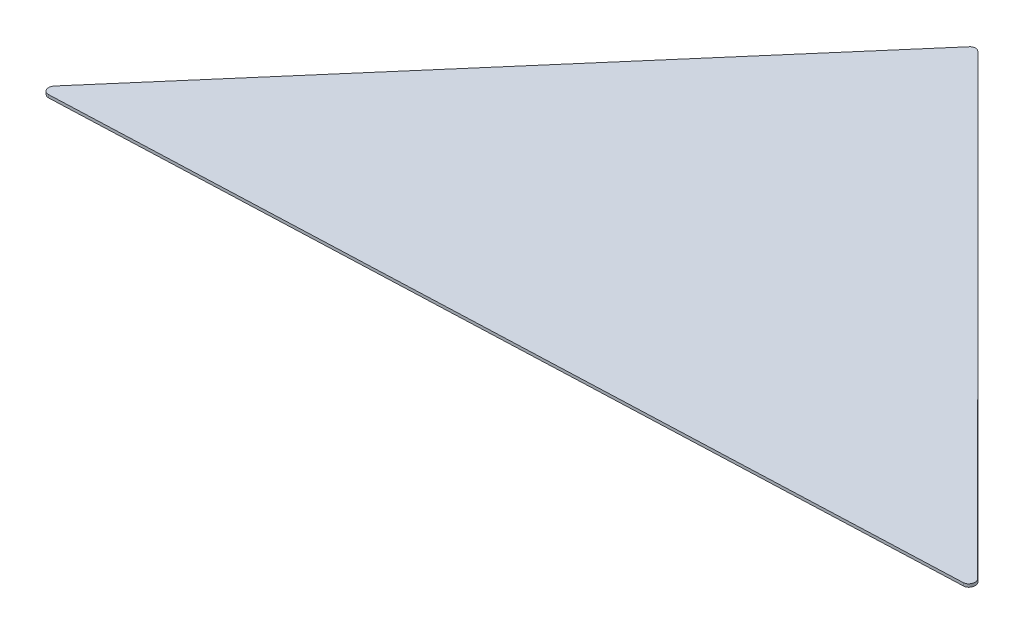
ISO-10303-21;
HEADER;
FILE_DESCRIPTION(('STEP AP214'),'2;1');
FILE_NAME('part.step','',(''),(''),'','','');
FILE_SCHEMA(('AUTOMOTIVE_DESIGN { 1 0 10303 214 1 1 1 1 }'));
ENDSEC;
DATA;
#1=APPLICATION_CONTEXT('core data for automotive mechanical design processes');
#2=APPLICATION_PROTOCOL_DEFINITION('international standard','automotive_design',2000,#1);
#3=PRODUCT_CONTEXT('',#1,'mechanical');
#4=PRODUCT('Part','Part','',(#3));
#5=PRODUCT_RELATED_PRODUCT_CATEGORY('part','',(#4));
#6=PRODUCT_DEFINITION_FORMATION('','',#4);
#7=PRODUCT_DEFINITION_CONTEXT('part definition',#1,'design');
#8=PRODUCT_DEFINITION('design','',#6,#7);
#9=PRODUCT_DEFINITION_SHAPE('','',#8);
#10=(LENGTH_UNIT() NAMED_UNIT(*) SI_UNIT(.MILLI.,.METRE.));
#11=(NAMED_UNIT(*) PLANE_ANGLE_UNIT() SI_UNIT($,.RADIAN.));
#12=(NAMED_UNIT(*) SI_UNIT($,.STERADIAN.) SOLID_ANGLE_UNIT());
#13=UNCERTAINTY_MEASURE_WITH_UNIT(LENGTH_MEASURE(1.E-05),#10,'distance_accuracy_value','');
#14=(GEOMETRIC_REPRESENTATION_CONTEXT(3) GLOBAL_UNCERTAINTY_ASSIGNED_CONTEXT((#13)) GLOBAL_UNIT_ASSIGNED_CONTEXT((#10,
#11,#12)) REPRESENTATION_CONTEXT('',''));
#15=CARTESIAN_POINT('',(0.,0.,0.));
#16=DIRECTION('',(0.,0.,1.));
#17=DIRECTION('',(1.,0.,0.));
#18=AXIS2_PLACEMENT_3D('',#15,#16,#17);
#19=CARTESIAN_POINT('',(198.888232937811,-1905.59670843705,-983.717640647093));
#20=DIRECTION('',(0.0386038565877099,-0.998597990155389,-0.0362187287763312));
#21=DIRECTION('',(0.999253613840912,0.0386292017245727,0.));
#22=AXIS2_PLACEMENT_3D('',#19,#20,#21);
#23=CYLINDRICAL_SURFACE('',#22,4.00000000000005);
#24=CARTESIAN_POINT('',(198.965440650987,-1907.59390441736,-983.790078104646));
#25=DIRECTION('',(0.0386038565877099,-0.998597990155389,-0.0362187287763312));
#26=DIRECTION('',(0.999253613840912,0.0386292017245728,0.));
#27=AXIS2_PLACEMENT_3D('',#24,#25,#26);
#28=CIRCLE('',#27,4.00000000000005);
#29=CARTESIAN_POINT('',(196.139005516917,-1907.60051112438,-986.620488107511));
#30=VERTEX_POINT('',#29);
#31=CARTESIAN_POINT('',(201.789780038685,-1907.38227418738,-986.614670051964));
#32=VERTEX_POINT('',#31);
#33=EDGE_CURVE('E125',#30,#32,#28,.T.);
#34=ORIENTED_EDGE('',*,*,#33,.F.);
#35=DIRECTION('',(0.0386038565877099,-0.998597990155389,-0.0362187287763312));
#36=VECTOR('',#35,1.);
#37=CARTESIAN_POINT('',(196.061797803741,-1905.60331514407,-986.548050649958));
#38=LINE('',#37,#36);
#39=CARTESIAN_POINT('',(196.061797803741,-1905.60331514407,-986.548050649958));
#40=VERTEX_POINT('',#39);
#41=EDGE_CURVE('E12',#40,#30,#38,.T.);
#42=ORIENTED_EDGE('',*,*,#41,.F.);
#43=CARTESIAN_POINT('',(198.888232937811,-1905.59670843705,-983.717640647093));
#44=DIRECTION('',(0.0386038565877099,-0.998597990155389,-0.0362187287763312));
#45=DIRECTION('',(0.999253613840912,0.0386292017245728,0.));
#46=AXIS2_PLACEMENT_3D('',#43,#44,#45);
#47=CIRCLE('',#46,4.00000000000005);
#48=CARTESIAN_POINT('',(201.71257232551,-1905.38507820707,-986.542232594411));
#49=VERTEX_POINT('',#48);
#50=EDGE_CURVE('E136',#40,#49,#47,.T.);
#51=ORIENTED_EDGE('',*,*,#50,.T.);
#52=DIRECTION('',(0.0386038565877099,-0.998597990155389,-0.0362187287763312));
#53=VECTOR('',#52,1.);
#54=CARTESIAN_POINT('',(201.71257232551,-1905.38507820707,-986.542232594411));
#55=LINE('',#54,#53);
#56=EDGE_CURVE('E36',#49,#32,#55,.T.);
#57=ORIENTED_EDGE('',*,*,#56,.T.);
#58=EDGE_LOOP('',(#34,#42,#51,#57));
#59=FACE_BOUND('',#58,.T.);
#60=ADVANCED_FACE('F33',(#59),#23,.T.);
#61=CARTESIAN_POINT('',(196.061797803741,-1905.60331514407,-986.548050649958));
#62=DIRECTION('',(0.706608783517483,0.00165167675470097,0.707602500716215));
#63=DIRECTION('',(0.707603465900774,0.,-0.70660974734659));
#64=AXIS2_PLACEMENT_3D('',#61,#62,#63);
#65=PLANE('',#64);
#66=DIRECTION('',(-0.706550613411735,-0.0529086573399465,0.70568187213927));
#67=VECTOR('',#66,1.);
#68=CARTESIAN_POINT('',(196.139005516917,-1907.60051112438,-986.620488107511));
#69=LINE('',#68,#67);
#70=CARTESIAN_POINT('',(-111.056145906529,-1930.60421771615,-679.803049337167));
#71=VERTEX_POINT('',#70);
#72=EDGE_CURVE('E72',#30,#71,#69,.T.);
#73=ORIENTED_EDGE('',*,*,#72,.T.);
#74=DIRECTION('',(0.0386038565877099,-0.998597990155389,-0.0362187287763312));
#75=VECTOR('',#74,1.);
#76=CARTESIAN_POINT('',(-111.133353619704,-1928.60702173584,-679.730611879615));
#77=LINE('',#76,#75);
#78=CARTESIAN_POINT('',(-111.133353619704,-1928.60702173584,-679.730611879615));
#79=VERTEX_POINT('',#78);
#80=EDGE_CURVE('E42',#79,#71,#77,.T.);
#81=ORIENTED_EDGE('',*,*,#80,.F.);
#82=DIRECTION('',(-0.706550613411735,-0.0529086573399465,0.70568187213927));
#83=VECTOR('',#82,1.);
#84=CARTESIAN_POINT('',(196.061797803741,-1905.60331514407,-986.548050649958));
#85=LINE('',#84,#83);
#86=EDGE_CURVE('E96',#40,#79,#85,.T.);
#87=ORIENTED_EDGE('',*,*,#86,.F.);
#88=ORIENTED_EDGE('',*,*,#41,.T.);
#89=EDGE_LOOP('',(#73,#81,#87,#88));
#90=FACE_BOUND('',#89,.T.);
#91=ADVANCED_FACE('F160',(#90),#65,.F.);
#92=CARTESIAN_POINT('',(-108.306918485634,-1928.60041502882,-676.90020187675));
#93=DIRECTION('',(0.0386038565877099,-0.998597990155389,-0.0362187287763312));
#94=DIRECTION('',(0.999253613840912,0.0386292017245727,0.));
#95=AXIS2_PLACEMENT_3D('',#92,#93,#94);
#96=CYLINDRICAL_SURFACE('',#95,4.);
#97=CARTESIAN_POINT('',(-108.229710772459,-1930.59761100913,-676.972639334302));
#98=DIRECTION('',(-0.0386038565877099,0.998597990155389,0.0362187287763312));
#99=DIRECTION('',(-0.999253613840912,-0.0386292017245728,0.));
#100=AXIS2_PLACEMENT_3D('',#97,#98,#99);
#101=CIRCLE('',#100,4.);
#102=CARTESIAN_POINT('',(-108.226912445595,-1930.74248592424,-672.975264767372));
#103=VERTEX_POINT('',#102);
#104=EDGE_CURVE('E103',#71,#103,#101,.T.);
#105=ORIENTED_EDGE('',*,*,#104,.T.);
#106=DIRECTION('',(0.0386038565877099,-0.998597990155389,-0.0362187287763312));
#107=VECTOR('',#106,1.);
#108=CARTESIAN_POINT('',(-108.304120158771,-1928.74528994393,-672.902827309819));
#109=LINE('',#108,#107);
#110=CARTESIAN_POINT('',(-108.304120158771,-1928.74528994393,-672.902827309819));
#111=VERTEX_POINT('',#110);
#112=EDGE_CURVE('E100',#111,#103,#109,.T.);
#113=ORIENTED_EDGE('',*,*,#112,.F.);
#114=CARTESIAN_POINT('',(-108.306918485634,-1928.60041502882,-676.90020187675));
#115=DIRECTION('',(-0.0386038565877099,0.998597990155389,0.0362187287763312));
#116=DIRECTION('',(-0.999253613840912,-0.0386292017245728,0.));
#117=AXIS2_PLACEMENT_3D('',#114,#115,#116);
#118=CIRCLE('',#117,4.);
#119=EDGE_CURVE('E90',#79,#111,#118,.T.);
#120=ORIENTED_EDGE('',*,*,#119,.F.);
#121=ORIENTED_EDGE('',*,*,#80,.T.);
#122=EDGE_LOOP('',(#105,#113,#120,#121));
#123=FACE_BOUND('',#122,.T.);
#124=ADVANCED_FACE('F101',(#123),#96,.T.);
#125=CARTESIAN_POINT('',(-108.304120158771,-1928.74528994393,-672.902827309819));
#126=DIRECTION('',(-0.00069958171596184,0.0362187287763312,-0.999343641732537));
#127=DIRECTION('',(0.,0.9993438862793,0.0362187376393214));
#128=AXIS2_PLACEMENT_3D('',#125,#126,#127);
#129=PLANE('',#128);
#130=DIRECTION('',(0.999254348422852,0.0386038565877099,0.000699581715961699));
#131=VECTOR('',#130,1.);
#132=CARTESIAN_POINT('',(-108.226912445595,-1930.74248592424,-672.975264767372));
#133=LINE('',#132,#131);
#134=CARTESIAN_POINT('',(506.18839824221,-1907.00598622672,-672.545110304655));
#135=VERTEX_POINT('',#134);
#136=EDGE_CURVE('E133',#103,#135,#133,.T.);
#137=ORIENTED_EDGE('',*,*,#136,.T.);
#138=DIRECTION('',(0.0386038565877099,-0.998597990155389,-0.0362187287763312));
#139=VECTOR('',#138,1.);
#140=CARTESIAN_POINT('',(506.111190529035,-1905.0087902464,-672.472672847102));
#141=LINE('',#140,#139);
#142=CARTESIAN_POINT('',(506.111190529035,-1905.0087902464,-672.472672847102));
#143=VERTEX_POINT('',#142);
#144=EDGE_CURVE('E106',#143,#135,#141,.T.);
#145=ORIENTED_EDGE('',*,*,#144,.F.);
#146=DIRECTION('',(0.999254348422852,0.0386038565877099,0.000699581715961699));
#147=VECTOR('',#146,1.);
#148=CARTESIAN_POINT('',(-108.304120158771,-1928.74528994393,-672.902827309819));
#149=LINE('',#148,#147);
#150=EDGE_CURVE('E94',#111,#143,#149,.T.);
#151=ORIENTED_EDGE('',*,*,#150,.F.);
#152=ORIENTED_EDGE('',*,*,#112,.T.);
#153=EDGE_LOOP('',(#137,#145,#151,#152));
#154=FACE_BOUND('',#153,.T.);
#155=ADVANCED_FACE('F108',(#154),#129,.F.);
#156=CARTESIAN_POINT('',(506.108392202171,-1904.8639153313,-676.470047414032));
#157=DIRECTION('',(0.0386038565877099,-0.998597990155389,-0.0362187287763312));
#158=DIRECTION('',(0.999253613840912,0.0386292017245727,0.));
#159=AXIS2_PLACEMENT_3D('',#156,#157,#158);
#160=CYLINDRICAL_SURFACE('',#159,3.99999999999996);
#161=CARTESIAN_POINT('',(506.185599915346,-1906.86111131161,-676.542484871585));
#162=DIRECTION('',(-0.0386038565877099,0.998597990155389,0.0362187287763312));
#163=DIRECTION('',(-0.999253613840912,-0.0386292017245728,0.));
#164=AXIS2_PLACEMENT_3D('',#161,#162,#163);
#165=CIRCLE('',#164,3.99999999999996);
#166=CARTESIAN_POINT('',(509.009939303045,-1906.64948108162,-679.367076818902));
#167=VERTEX_POINT('',#166);
#168=EDGE_CURVE('E131',#135,#167,#165,.T.);
#169=ORIENTED_EDGE('',*,*,#168,.T.);
#170=DIRECTION('',(0.0386038565877099,-0.998597990155389,-0.0362187287763312));
#171=VECTOR('',#170,1.);
#172=CARTESIAN_POINT('',(508.932731589869,-1904.65228510131,-679.29463936135));
#173=LINE('',#172,#171);
#174=CARTESIAN_POINT('',(508.932731589869,-1904.65228510131,-679.29463936135));
#175=VERTEX_POINT('',#174);
#176=EDGE_CURVE('E139',#175,#167,#173,.T.);
#177=ORIENTED_EDGE('',*,*,#176,.F.);
#178=CARTESIAN_POINT('',(506.108392202171,-1904.8639153313,-676.470047414032));
#179=DIRECTION('',(-0.0386038565877099,0.998597990155389,0.0362187287763312));
#180=DIRECTION('',(-0.999253613840912,-0.0386292017245728,0.));
#181=AXIS2_PLACEMENT_3D('',#178,#179,#180);
#182=CIRCLE('',#181,3.99999999999996);
#183=EDGE_CURVE('E111',#143,#175,#182,.T.);
#184=ORIENTED_EDGE('',*,*,#183,.F.);
#185=ORIENTED_EDGE('',*,*,#144,.T.);
#186=EDGE_LOOP('',(#169,#177,#184,#185));
#187=FACE_BOUND('',#186,.T.);
#188=ADVANCED_FACE('F149',(#187),#160,.T.);
#189=CARTESIAN_POINT('',(508.932731589869,-1904.65228510131,-679.29463936135));
#190=DIRECTION('',(-0.706084846924593,-0.0529075574968228,0.706147986829386));
#191=DIRECTION('',(0.707138394710657,0.,0.707075166248989));
#192=AXIS2_PLACEMENT_3D('',#189,#190,#191);
#193=PLANE('',#192);
#194=DIRECTION('',(-0.707074204875294,-0.00168654004942269,-0.707137344780087));
#195=VECTOR('',#194,1.);
#196=CARTESIAN_POINT('',(509.009939303045,-1906.64948108162,-679.367076818902));
#197=LINE('',#196,#195);
#198=EDGE_CURVE('E128',#167,#32,#197,.T.);
#199=ORIENTED_EDGE('',*,*,#198,.T.);
#200=ORIENTED_EDGE('',*,*,#56,.F.);
#201=DIRECTION('',(-0.707074204875294,-0.00168654004942269,-0.707137344780087));
#202=VECTOR('',#201,1.);
#203=CARTESIAN_POINT('',(508.932731589869,-1904.65228510131,-679.29463936135));
#204=LINE('',#203,#202);
#205=EDGE_CURVE('E82',#175,#49,#204,.T.);
#206=ORIENTED_EDGE('',*,*,#205,.F.);
#207=ORIENTED_EDGE('',*,*,#176,.T.);
#208=EDGE_LOOP('',(#199,#200,#206,#207));
#209=FACE_BOUND('',#208,.T.);
#210=ADVANCED_FACE('F144',(#209),#193,.F.);
#211=CARTESIAN_POINT('',(198.888232937811,-1905.59670843705,-983.717640647093));
#212=DIRECTION('',(0.0386038565877099,-0.998597990155389,-0.0362187287763312));
#213=DIRECTION('',(0.999253613840912,0.0386292017245728,0.));
#214=AXIS2_PLACEMENT_3D('',#211,#212,#213);
#215=PLANE('',#214);
#216=ORIENTED_EDGE('',*,*,#50,.F.);
#217=ORIENTED_EDGE('',*,*,#86,.T.);
#218=ORIENTED_EDGE('',*,*,#119,.T.);
#219=ORIENTED_EDGE('',*,*,#150,.T.);
#220=ORIENTED_EDGE('',*,*,#183,.T.);
#221=ORIENTED_EDGE('',*,*,#205,.T.);
#222=EDGE_LOOP('',(#216,#217,#218,#219,#220,#221));
#223=FACE_BOUND('',#222,.T.);
#224=ADVANCED_FACE('F92',(#223),#215,.F.);
#225=CARTESIAN_POINT('',(198.965440650987,-1907.59390441736,-983.790078104646));
#226=DIRECTION('',(0.0386038565877099,-0.998597990155389,-0.0362187287763312));
#227=DIRECTION('',(0.999253613840912,0.0386292017245728,0.));
#228=AXIS2_PLACEMENT_3D('',#225,#226,#227);
#229=PLANE('',#228);
#230=ORIENTED_EDGE('',*,*,#33,.T.);
#231=ORIENTED_EDGE('',*,*,#198,.F.);
#232=ORIENTED_EDGE('',*,*,#168,.F.);
#233=ORIENTED_EDGE('',*,*,#136,.F.);
#234=ORIENTED_EDGE('',*,*,#104,.F.);
#235=ORIENTED_EDGE('',*,*,#72,.F.);
#236=EDGE_LOOP('',(#230,#231,#232,#233,#234,#235));
#237=FACE_BOUND('',#236,.T.);
#238=ADVANCED_FACE('F147',(#237),#229,.T.);
#239=CLOSED_SHELL('',(#60,#91,#124,#155,#188,#210,#224,#238));
#240=MANIFOLD_SOLID_BREP('B2',#239);
#241=ADVANCED_BREP_SHAPE_REPRESENTATION('',(#18,#240),#14);
#242=SHAPE_DEFINITION_REPRESENTATION(#9,#241);
ENDSEC;
END-ISO-10303-21;
